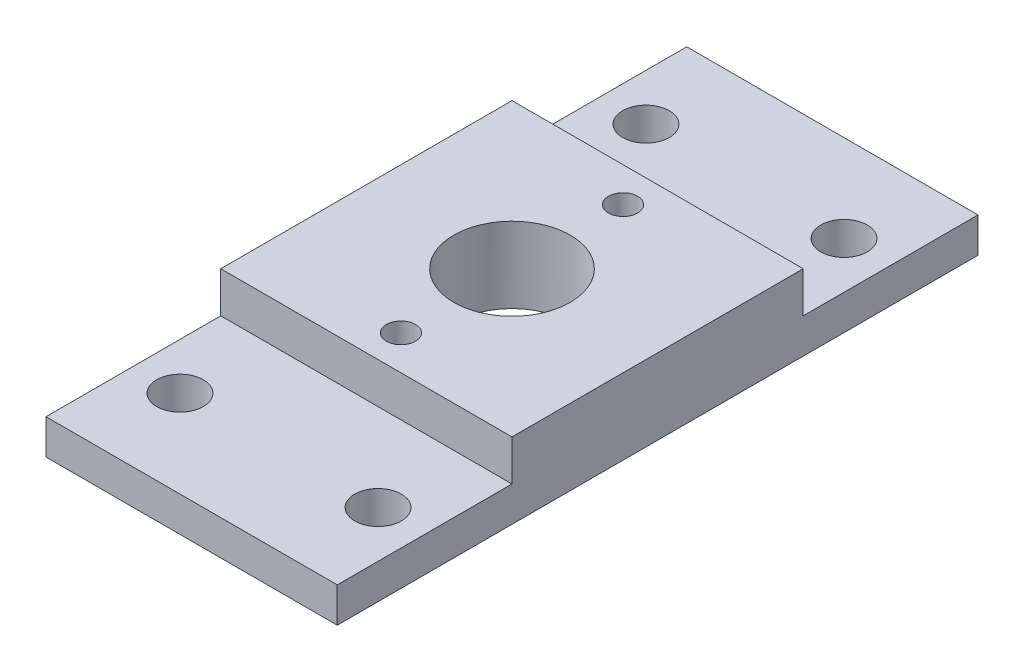
ISO-10303-21;
HEADER;
FILE_DESCRIPTION(('STEP AP214'),'2;1');
FILE_NAME('part.step','',(''),(''),'','','');
FILE_SCHEMA(('AUTOMOTIVE_DESIGN { 1 0 10303 214 1 1 1 1 }'));
ENDSEC;
DATA;
#1=APPLICATION_CONTEXT('core data for automotive mechanical design processes');
#2=APPLICATION_PROTOCOL_DEFINITION('international standard','automotive_design',2000,#1);
#3=PRODUCT_CONTEXT('',#1,'mechanical');
#4=PRODUCT('Part','Part','',(#3));
#5=PRODUCT_RELATED_PRODUCT_CATEGORY('part','',(#4));
#6=PRODUCT_DEFINITION_FORMATION('','',#4);
#7=PRODUCT_DEFINITION_CONTEXT('part definition',#1,'design');
#8=PRODUCT_DEFINITION('design','',#6,#7);
#9=PRODUCT_DEFINITION_SHAPE('','',#8);
#10=(LENGTH_UNIT() NAMED_UNIT(*) SI_UNIT(.MILLI.,.METRE.));
#11=(NAMED_UNIT(*) PLANE_ANGLE_UNIT() SI_UNIT($,.RADIAN.));
#12=(NAMED_UNIT(*) SI_UNIT($,.STERADIAN.) SOLID_ANGLE_UNIT());
#13=UNCERTAINTY_MEASURE_WITH_UNIT(LENGTH_MEASURE(1.E-05),#10,'distance_accuracy_value','');
#14=(GEOMETRIC_REPRESENTATION_CONTEXT(3) GLOBAL_UNCERTAINTY_ASSIGNED_CONTEXT((#13)) GLOBAL_UNIT_ASSIGNED_CONTEXT((#10,
#11,#12)) REPRESENTATION_CONTEXT('',''));
#15=CARTESIAN_POINT('',(0.,0.,0.));
#16=DIRECTION('',(0.,0.,1.));
#17=DIRECTION('',(1.,0.,0.));
#18=AXIS2_PLACEMENT_3D('',#15,#16,#17);
#19=CARTESIAN_POINT('',(-12.5,3.,27.5));
#20=DIRECTION('',(0.,0.,1.));
#21=DIRECTION('',(1.,0.,0.));
#22=AXIS2_PLACEMENT_3D('',#19,#20,#21);
#23=PLANE('',#22);
#24=DIRECTION('',(1.,0.,0.));
#25=VECTOR('',#24,1.);
#26=CARTESIAN_POINT('',(-12.5,0.,27.5));
#27=LINE('',#26,#25);
#28=CARTESIAN_POINT('',(-12.5,0.,27.5));
#29=VERTEX_POINT('',#28);
#30=CARTESIAN_POINT('',(12.5,0.,27.5));
#31=VERTEX_POINT('',#30);
#32=EDGE_CURVE('E13',#29,#31,#27,.T.);
#33=ORIENTED_EDGE('',*,*,#32,.T.);
#34=DIRECTION('',(0.,-1.,0.));
#35=VECTOR('',#34,1.);
#36=CARTESIAN_POINT('',(12.5,3.,27.5));
#37=LINE('',#36,#35);
#38=CARTESIAN_POINT('',(12.5,3.,27.5));
#39=VERTEX_POINT('',#38);
#40=EDGE_CURVE('E125',#39,#31,#37,.T.);
#41=ORIENTED_EDGE('',*,*,#40,.F.);
#42=DIRECTION('',(1.,0.,0.));
#43=VECTOR('',#42,1.);
#44=CARTESIAN_POINT('',(-12.5,3.,27.5));
#45=LINE('',#44,#43);
#46=CARTESIAN_POINT('',(-12.5,3.,27.5));
#47=VERTEX_POINT('',#46);
#48=EDGE_CURVE('E54',#47,#39,#45,.T.);
#49=ORIENTED_EDGE('',*,*,#48,.F.);
#50=DIRECTION('',(0.,-1.,0.));
#51=VECTOR('',#50,1.);
#52=CARTESIAN_POINT('',(-12.5,3.,27.5));
#53=LINE('',#52,#51);
#54=EDGE_CURVE('E116',#47,#29,#53,.T.);
#55=ORIENTED_EDGE('',*,*,#54,.T.);
#56=EDGE_LOOP('',(#33,#41,#49,#55));
#57=FACE_BOUND('',#56,.T.);
#58=ADVANCED_FACE('F45',(#57),#23,.T.);
#59=CARTESIAN_POINT('',(-12.5,3.,12.5));
#60=DIRECTION('',(0.,1.,0.));
#61=DIRECTION('',(0.,0.,1.));
#62=AXIS2_PLACEMENT_3D('',#59,#60,#61);
#63=PLANE('',#62);
#64=CARTESIAN_POINT('',(8.5,3.,20.));
#65=DIRECTION('',(0.,1.,0.));
#66=DIRECTION('',(0.,0.,1.));
#67=AXIS2_PLACEMENT_3D('',#64,#65,#66);
#68=CIRCLE('',#67,2.);
#69=CARTESIAN_POINT('',(8.5,3.,22.));
#70=VERTEX_POINT('',#69);
#71=EDGE_CURVE('E257',#70,#70,#68,.T.);
#72=ORIENTED_EDGE('',*,*,#71,.F.);
#73=EDGE_LOOP('',(#72));
#74=FACE_BOUND('',#73,.T.);
#75=CARTESIAN_POINT('',(-8.5,3.,20.));
#76=DIRECTION('',(0.,1.,0.));
#77=DIRECTION('',(0.,0.,-1.));
#78=AXIS2_PLACEMENT_3D('',#75,#76,#77);
#79=CIRCLE('',#78,2.);
#80=CARTESIAN_POINT('',(-8.5,3.,18.));
#81=VERTEX_POINT('',#80);
#82=EDGE_CURVE('E252',#81,#81,#79,.T.);
#83=ORIENTED_EDGE('',*,*,#82,.F.);
#84=EDGE_LOOP('',(#83));
#85=FACE_BOUND('',#84,.T.);
#86=ORIENTED_EDGE('',*,*,#48,.T.);
#87=DIRECTION('',(0.,0.,1.));
#88=VECTOR('',#87,1.);
#89=CARTESIAN_POINT('',(12.5,3.,12.5));
#90=LINE('',#89,#88);
#91=CARTESIAN_POINT('',(12.5,3.,12.5));
#92=VERTEX_POINT('',#91);
#93=EDGE_CURVE('E143',#92,#39,#90,.T.);
#94=ORIENTED_EDGE('',*,*,#93,.F.);
#95=DIRECTION('',(1.,0.,0.));
#96=VECTOR('',#95,1.);
#97=CARTESIAN_POINT('',(-12.5,3.,12.5));
#98=LINE('',#97,#96);
#99=CARTESIAN_POINT('',(-12.5,3.,12.5));
#100=VERTEX_POINT('',#99);
#101=EDGE_CURVE('E165',#100,#92,#98,.T.);
#102=ORIENTED_EDGE('',*,*,#101,.F.);
#103=DIRECTION('',(0.,0.,1.));
#104=VECTOR('',#103,1.);
#105=CARTESIAN_POINT('',(-12.5,3.,12.5));
#106=LINE('',#105,#104);
#107=EDGE_CURVE('E161',#100,#47,#106,.T.);
#108=ORIENTED_EDGE('',*,*,#107,.T.);
#109=EDGE_LOOP('',(#86,#94,#102,#108));
#110=FACE_BOUND('',#109,.T.);
#111=ADVANCED_FACE('F193',(#74,#85,#110),#63,.T.);
#112=CARTESIAN_POINT('',(-12.5,6.5,12.5));
#113=DIRECTION('',(0.,0.,1.));
#114=DIRECTION('',(1.,0.,0.));
#115=AXIS2_PLACEMENT_3D('',#112,#113,#114);
#116=PLANE('',#115);
#117=ORIENTED_EDGE('',*,*,#101,.T.);
#118=DIRECTION('',(0.,-1.,0.));
#119=VECTOR('',#118,1.);
#120=CARTESIAN_POINT('',(12.5,6.5,12.5));
#121=LINE('',#120,#119);
#122=CARTESIAN_POINT('',(12.5,6.5,12.5));
#123=VERTEX_POINT('',#122);
#124=EDGE_CURVE('E140',#123,#92,#121,.T.);
#125=ORIENTED_EDGE('',*,*,#124,.F.);
#126=DIRECTION('',(1.,0.,0.));
#127=VECTOR('',#126,1.);
#128=CARTESIAN_POINT('',(-12.5,6.5,12.5));
#129=LINE('',#128,#127);
#130=CARTESIAN_POINT('',(-12.5,6.5,12.5));
#131=VERTEX_POINT('',#130);
#132=EDGE_CURVE('E167',#131,#123,#129,.T.);
#133=ORIENTED_EDGE('',*,*,#132,.F.);
#134=DIRECTION('',(0.,-1.,0.));
#135=VECTOR('',#134,1.);
#136=CARTESIAN_POINT('',(-12.5,6.5,12.5));
#137=LINE('',#136,#135);
#138=EDGE_CURVE('E158',#131,#100,#137,.T.);
#139=ORIENTED_EDGE('',*,*,#138,.T.);
#140=EDGE_LOOP('',(#117,#125,#133,#139));
#141=FACE_BOUND('',#140,.T.);
#142=ADVANCED_FACE('F189',(#141),#116,.T.);
#143=CARTESIAN_POINT('',(-12.5,6.5,-12.5));
#144=DIRECTION('',(0.,1.,0.));
#145=DIRECTION('',(0.,0.,1.));
#146=AXIS2_PLACEMENT_3D('',#143,#144,#145);
#147=PLANE('',#146);
#148=CARTESIAN_POINT('',(0.,6.5,-9.53));
#149=DIRECTION('',(0.,1.,0.));
#150=DIRECTION('',(0.,0.,1.));
#151=AXIS2_PLACEMENT_3D('',#148,#149,#150);
#152=CIRCLE('',#151,1.24999999999999);
#153=CARTESIAN_POINT('',(0.,6.5,-8.28000000000001));
#154=VERTEX_POINT('',#153);
#155=EDGE_CURVE('E273',#154,#154,#152,.T.);
#156=ORIENTED_EDGE('',*,*,#155,.F.);
#157=EDGE_LOOP('',(#156));
#158=FACE_BOUND('',#157,.T.);
#159=CARTESIAN_POINT('',(0.,6.5,9.53));
#160=DIRECTION('',(0.,1.,0.));
#161=DIRECTION('',(0.,0.,1.));
#162=AXIS2_PLACEMENT_3D('',#159,#160,#161);
#163=CIRCLE('',#162,1.24999999999999);
#164=CARTESIAN_POINT('',(0.,6.5,10.78));
#165=VERTEX_POINT('',#164);
#166=EDGE_CURVE('E269',#165,#165,#163,.T.);
#167=ORIENTED_EDGE('',*,*,#166,.F.);
#168=EDGE_LOOP('',(#167));
#169=FACE_BOUND('',#168,.T.);
#170=CARTESIAN_POINT('',(0.,6.5,0.));
#171=DIRECTION('',(0.,1.,0.));
#172=DIRECTION('',(0.,0.,1.));
#173=AXIS2_PLACEMENT_3D('',#170,#171,#172);
#174=CIRCLE('',#173,5.);
#175=CARTESIAN_POINT('',(0.,6.5,5.));
#176=VERTEX_POINT('',#175);
#177=EDGE_CURVE('E255',#176,#176,#174,.T.);
#178=ORIENTED_EDGE('',*,*,#177,.F.);
#179=EDGE_LOOP('',(#178));
#180=FACE_BOUND('',#179,.T.);
#181=ORIENTED_EDGE('',*,*,#132,.T.);
#182=DIRECTION('',(0.,0.,1.));
#183=VECTOR('',#182,1.);
#184=CARTESIAN_POINT('',(12.5,6.5,-12.5));
#185=LINE('',#184,#183);
#186=CARTESIAN_POINT('',(12.5,6.5,-12.5));
#187=VERTEX_POINT('',#186);
#188=EDGE_CURVE('E137',#187,#123,#185,.T.);
#189=ORIENTED_EDGE('',*,*,#188,.F.);
#190=DIRECTION('',(1.,0.,0.));
#191=VECTOR('',#190,1.);
#192=CARTESIAN_POINT('',(-12.5,6.5,-12.5));
#193=LINE('',#192,#191);
#194=CARTESIAN_POINT('',(-12.5,6.5,-12.5));
#195=VERTEX_POINT('',#194);
#196=EDGE_CURVE('E169',#195,#187,#193,.T.);
#197=ORIENTED_EDGE('',*,*,#196,.F.);
#198=DIRECTION('',(0.,0.,1.));
#199=VECTOR('',#198,1.);
#200=CARTESIAN_POINT('',(-12.5,6.5,-12.5));
#201=LINE('',#200,#199);
#202=EDGE_CURVE('E155',#195,#131,#201,.T.);
#203=ORIENTED_EDGE('',*,*,#202,.T.);
#204=EDGE_LOOP('',(#181,#189,#197,#203));
#205=FACE_BOUND('',#204,.T.);
#206=ADVANCED_FACE('F182',(#158,#169,#180,#205),#147,.T.);
#207=CARTESIAN_POINT('',(-12.5,3.,-12.5));
#208=DIRECTION('',(0.,0.,-1.));
#209=DIRECTION('',(-1.,0.,0.));
#210=AXIS2_PLACEMENT_3D('',#207,#208,#209);
#211=PLANE('',#210);
#212=ORIENTED_EDGE('',*,*,#196,.T.);
#213=DIRECTION('',(0.,1.,0.));
#214=VECTOR('',#213,1.);
#215=CARTESIAN_POINT('',(12.5,3.,-12.5));
#216=LINE('',#215,#214);
#217=CARTESIAN_POINT('',(12.5,3.,-12.5));
#218=VERTEX_POINT('',#217);
#219=EDGE_CURVE('E131',#218,#187,#216,.T.);
#220=ORIENTED_EDGE('',*,*,#219,.F.);
#221=DIRECTION('',(1.,0.,0.));
#222=VECTOR('',#221,1.);
#223=CARTESIAN_POINT('',(-12.5,3.,-12.5));
#224=LINE('',#223,#222);
#225=CARTESIAN_POINT('',(-12.5,3.,-12.5));
#226=VERTEX_POINT('',#225);
#227=EDGE_CURVE('E171',#226,#218,#224,.T.);
#228=ORIENTED_EDGE('',*,*,#227,.F.);
#229=DIRECTION('',(0.,1.,0.));
#230=VECTOR('',#229,1.);
#231=CARTESIAN_POINT('',(-12.5,3.,-12.5));
#232=LINE('',#231,#230);
#233=EDGE_CURVE('E152',#226,#195,#232,.T.);
#234=ORIENTED_EDGE('',*,*,#233,.T.);
#235=EDGE_LOOP('',(#212,#220,#228,#234));
#236=FACE_BOUND('',#235,.T.);
#237=ADVANCED_FACE('F179',(#236),#211,.T.);
#238=CARTESIAN_POINT('',(-12.5,3.,-27.5));
#239=DIRECTION('',(0.,1.,0.));
#240=DIRECTION('',(0.,0.,1.));
#241=AXIS2_PLACEMENT_3D('',#238,#239,#240);
#242=PLANE('',#241);
#243=CARTESIAN_POINT('',(8.5,3.,-20.));
#244=DIRECTION('',(0.,1.,0.));
#245=DIRECTION('',(0.,0.,-1.));
#246=AXIS2_PLACEMENT_3D('',#243,#244,#245);
#247=CIRCLE('',#246,2.);
#248=CARTESIAN_POINT('',(8.5,3.,-22.));
#249=VERTEX_POINT('',#248);
#250=EDGE_CURVE('E261',#249,#249,#247,.T.);
#251=ORIENTED_EDGE('',*,*,#250,.F.);
#252=EDGE_LOOP('',(#251));
#253=FACE_BOUND('',#252,.T.);
#254=CARTESIAN_POINT('',(-8.5,3.,-20.));
#255=DIRECTION('',(0.,1.,0.));
#256=DIRECTION('',(0.,0.,1.));
#257=AXIS2_PLACEMENT_3D('',#254,#255,#256);
#258=CIRCLE('',#257,2.);
#259=CARTESIAN_POINT('',(-8.5,3.,-18.));
#260=VERTEX_POINT('',#259);
#261=EDGE_CURVE('E248',#260,#260,#258,.T.);
#262=ORIENTED_EDGE('',*,*,#261,.F.);
#263=EDGE_LOOP('',(#262));
#264=FACE_BOUND('',#263,.T.);
#265=ORIENTED_EDGE('',*,*,#227,.T.);
#266=DIRECTION('',(0.,0.,1.));
#267=VECTOR('',#266,1.);
#268=CARTESIAN_POINT('',(12.5,3.,-27.5));
#269=LINE('',#268,#267);
#270=CARTESIAN_POINT('',(12.5,3.,-27.5));
#271=VERTEX_POINT('',#270);
#272=EDGE_CURVE('E129',#271,#218,#269,.T.);
#273=ORIENTED_EDGE('',*,*,#272,.F.);
#274=DIRECTION('',(1.,0.,0.));
#275=VECTOR('',#274,1.);
#276=CARTESIAN_POINT('',(-12.5,3.,-27.5));
#277=LINE('',#276,#275);
#278=CARTESIAN_POINT('',(-12.5,3.,-27.5));
#279=VERTEX_POINT('',#278);
#280=EDGE_CURVE('E115',#279,#271,#277,.T.);
#281=ORIENTED_EDGE('',*,*,#280,.F.);
#282=DIRECTION('',(0.,0.,1.));
#283=VECTOR('',#282,1.);
#284=CARTESIAN_POINT('',(-12.5,3.,-27.5));
#285=LINE('',#284,#283);
#286=EDGE_CURVE('E149',#279,#226,#285,.T.);
#287=ORIENTED_EDGE('',*,*,#286,.T.);
#288=EDGE_LOOP('',(#265,#273,#281,#287));
#289=FACE_BOUND('',#288,.T.);
#290=ADVANCED_FACE('F173',(#253,#264,#289),#242,.T.);
#291=CARTESIAN_POINT('',(-12.5,0.,-27.5));
#292=DIRECTION('',(0.,0.,-1.));
#293=DIRECTION('',(-1.,0.,0.));
#294=AXIS2_PLACEMENT_3D('',#291,#292,#293);
#295=PLANE('',#294);
#296=ORIENTED_EDGE('',*,*,#280,.T.);
#297=DIRECTION('',(0.,1.,0.));
#298=VECTOR('',#297,1.);
#299=CARTESIAN_POINT('',(12.5,0.,-27.5));
#300=LINE('',#299,#298);
#301=CARTESIAN_POINT('',(12.5,0.,-27.5));
#302=VERTEX_POINT('',#301);
#303=EDGE_CURVE('E122',#302,#271,#300,.T.);
#304=ORIENTED_EDGE('',*,*,#303,.F.);
#305=DIRECTION('',(1.,0.,0.));
#306=VECTOR('',#305,1.);
#307=CARTESIAN_POINT('',(-12.5,0.,-27.5));
#308=LINE('',#307,#306);
#309=CARTESIAN_POINT('',(-12.5,0.,-27.5));
#310=VERTEX_POINT('',#309);
#311=EDGE_CURVE('E49',#310,#302,#308,.T.);
#312=ORIENTED_EDGE('',*,*,#311,.F.);
#313=DIRECTION('',(0.,1.,0.));
#314=VECTOR('',#313,1.);
#315=CARTESIAN_POINT('',(-12.5,0.,-27.5));
#316=LINE('',#315,#314);
#317=EDGE_CURVE('E147',#310,#279,#316,.T.);
#318=ORIENTED_EDGE('',*,*,#317,.T.);
#319=EDGE_LOOP('',(#296,#304,#312,#318));
#320=FACE_BOUND('',#319,.T.);
#321=ADVANCED_FACE('F128',(#320),#295,.T.);
#322=CARTESIAN_POINT('',(-12.5,0.,0.));
#323=DIRECTION('',(0.,-1.,0.));
#324=DIRECTION('',(0.,0.,-1.));
#325=AXIS2_PLACEMENT_3D('',#322,#323,#324);
#326=PLANE('',#325);
#327=CARTESIAN_POINT('',(0.,0.,-9.53));
#328=DIRECTION('',(0.,-1.,0.));
#329=DIRECTION('',(0.,0.,-1.));
#330=AXIS2_PLACEMENT_3D('',#327,#328,#329);
#331=CIRCLE('',#330,1.24999999999999);
#332=CARTESIAN_POINT('',(0.,0.,-10.78));
#333=VERTEX_POINT('',#332);
#334=EDGE_CURVE('E224',#333,#333,#331,.T.);
#335=ORIENTED_EDGE('',*,*,#334,.F.);
#336=EDGE_LOOP('',(#335));
#337=FACE_BOUND('',#336,.T.);
#338=CARTESIAN_POINT('',(0.,0.,9.53));
#339=DIRECTION('',(0.,-1.,0.));
#340=DIRECTION('',(0.,0.,-1.));
#341=AXIS2_PLACEMENT_3D('',#338,#339,#340);
#342=CIRCLE('',#341,1.24999999999999);
#343=CARTESIAN_POINT('',(0.,0.,8.28000000000001));
#344=VERTEX_POINT('',#343);
#345=EDGE_CURVE('E228',#344,#344,#342,.T.);
#346=ORIENTED_EDGE('',*,*,#345,.F.);
#347=EDGE_LOOP('',(#346));
#348=FACE_BOUND('',#347,.T.);
#349=CARTESIAN_POINT('',(0.,0.,0.));
#350=DIRECTION('',(0.,-1.,0.));
#351=DIRECTION('',(0.,0.,-1.));
#352=AXIS2_PLACEMENT_3D('',#349,#350,#351);
#353=CIRCLE('',#352,5.);
#354=CARTESIAN_POINT('',(0.,0.,-5.));
#355=VERTEX_POINT('',#354);
#356=EDGE_CURVE('E232',#355,#355,#353,.F.);
#357=ORIENTED_EDGE('',*,*,#356,.T.);
#358=EDGE_LOOP('',(#357));
#359=FACE_BOUND('',#358,.T.);
#360=CARTESIAN_POINT('',(8.5,0.,-20.));
#361=DIRECTION('',(0.,1.,0.));
#362=DIRECTION('',(0.,0.,-1.));
#363=AXIS2_PLACEMENT_3D('',#360,#361,#362);
#364=CIRCLE('',#363,2.);
#365=CARTESIAN_POINT('',(8.5,0.,-22.));
#366=VERTEX_POINT('',#365);
#367=EDGE_CURVE('E236',#366,#366,#364,.T.);
#368=ORIENTED_EDGE('',*,*,#367,.T.);
#369=EDGE_LOOP('',(#368));
#370=FACE_BOUND('',#369,.T.);
#371=CARTESIAN_POINT('',(8.5,0.,20.));
#372=DIRECTION('',(0.,1.,0.));
#373=DIRECTION('',(0.,0.,1.));
#374=AXIS2_PLACEMENT_3D('',#371,#372,#373);
#375=CIRCLE('',#374,2.);
#376=CARTESIAN_POINT('',(8.5,0.,22.));
#377=VERTEX_POINT('',#376);
#378=EDGE_CURVE('E240',#377,#377,#375,.T.);
#379=ORIENTED_EDGE('',*,*,#378,.T.);
#380=EDGE_LOOP('',(#379));
#381=FACE_BOUND('',#380,.T.);
#382=CARTESIAN_POINT('',(-8.5,0.,20.));
#383=DIRECTION('',(0.,1.,0.));
#384=DIRECTION('',(0.,0.,-1.));
#385=AXIS2_PLACEMENT_3D('',#382,#383,#384);
#386=CIRCLE('',#385,2.);
#387=CARTESIAN_POINT('',(-8.5,0.,18.));
#388=VERTEX_POINT('',#387);
#389=EDGE_CURVE('E244',#388,#388,#386,.T.);
#390=ORIENTED_EDGE('',*,*,#389,.T.);
#391=EDGE_LOOP('',(#390));
#392=FACE_BOUND('',#391,.T.);
#393=CARTESIAN_POINT('',(-8.5,0.,-20.));
#394=DIRECTION('',(0.,1.,0.));
#395=DIRECTION('',(0.,0.,1.));
#396=AXIS2_PLACEMENT_3D('',#393,#394,#395);
#397=CIRCLE('',#396,2.);
#398=CARTESIAN_POINT('',(-8.5,0.,-18.));
#399=VERTEX_POINT('',#398);
#400=EDGE_CURVE('E126',#399,#399,#397,.T.);
#401=ORIENTED_EDGE('',*,*,#400,.T.);
#402=EDGE_LOOP('',(#401));
#403=FACE_BOUND('',#402,.T.);
#404=ORIENTED_EDGE('',*,*,#311,.T.);
#405=DIRECTION('',(0.,0.,-1.));
#406=VECTOR('',#405,1.);
#407=CARTESIAN_POINT('',(12.5,0.,27.5));
#408=LINE('',#407,#406);
#409=EDGE_CURVE('E109',#31,#302,#408,.T.);
#410=ORIENTED_EDGE('',*,*,#409,.F.);
#411=ORIENTED_EDGE('',*,*,#32,.F.);
#412=DIRECTION('',(0.,0.,-1.));
#413=VECTOR('',#412,1.);
#414=CARTESIAN_POINT('',(-12.5,0.,27.5));
#415=LINE('',#414,#413);
#416=EDGE_CURVE('E110',#29,#310,#415,.T.);
#417=ORIENTED_EDGE('',*,*,#416,.T.);
#418=EDGE_LOOP('',(#404,#410,#411,#417));
#419=FACE_BOUND('',#418,.T.);
#420=ADVANCED_FACE('F47',(#337,#348,#359,#370,#381,#392,#403,#419),#326,.T.);
#421=CARTESIAN_POINT('',(-12.5,0.,0.));
#422=DIRECTION('',(1.,0.,0.));
#423=DIRECTION('',(0.,0.,-1.));
#424=AXIS2_PLACEMENT_3D('',#421,#422,#423);
#425=PLANE('',#424);
#426=ORIENTED_EDGE('',*,*,#416,.F.);
#427=ORIENTED_EDGE('',*,*,#54,.F.);
#428=ORIENTED_EDGE('',*,*,#107,.F.);
#429=ORIENTED_EDGE('',*,*,#138,.F.);
#430=ORIENTED_EDGE('',*,*,#202,.F.);
#431=ORIENTED_EDGE('',*,*,#233,.F.);
#432=ORIENTED_EDGE('',*,*,#286,.F.);
#433=ORIENTED_EDGE('',*,*,#317,.F.);
#434=EDGE_LOOP('',(#426,#427,#428,#429,#430,#431,#432,#433));
#435=FACE_BOUND('',#434,.T.);
#436=ADVANCED_FACE('F185',(#435),#425,.F.);
#437=CARTESIAN_POINT('',(12.5,0.,0.));
#438=DIRECTION('',(1.,0.,0.));
#439=DIRECTION('',(0.,0.,-1.));
#440=AXIS2_PLACEMENT_3D('',#437,#438,#439);
#441=PLANE('',#440);
#442=ORIENTED_EDGE('',*,*,#409,.T.);
#443=ORIENTED_EDGE('',*,*,#303,.T.);
#444=ORIENTED_EDGE('',*,*,#272,.T.);
#445=ORIENTED_EDGE('',*,*,#219,.T.);
#446=ORIENTED_EDGE('',*,*,#188,.T.);
#447=ORIENTED_EDGE('',*,*,#124,.T.);
#448=ORIENTED_EDGE('',*,*,#93,.T.);
#449=ORIENTED_EDGE('',*,*,#40,.T.);
#450=EDGE_LOOP('',(#442,#443,#444,#445,#446,#447,#448,#449));
#451=FACE_BOUND('',#450,.T.);
#452=ADVANCED_FACE('F120',(#451),#441,.T.);
#453=CARTESIAN_POINT('',(-8.5,0.,-20.));
#454=DIRECTION('',(0.,1.,0.));
#455=DIRECTION('',(0.,0.,1.));
#456=AXIS2_PLACEMENT_3D('',#453,#454,#455);
#457=CYLINDRICAL_SURFACE('',#456,2.);
#458=ORIENTED_EDGE('',*,*,#400,.F.);
#459=EDGE_LOOP('',(#458));
#460=FACE_BOUND('',#459,.T.);
#461=ORIENTED_EDGE('',*,*,#261,.T.);
#462=EDGE_LOOP('',(#461));
#463=FACE_BOUND('',#462,.T.);
#464=ADVANCED_FACE('F307',(#460,#463),#457,.F.);
#465=CARTESIAN_POINT('',(-8.5,0.,20.));
#466=DIRECTION('',(0.,1.,0.));
#467=DIRECTION('',(0.,0.,1.));
#468=AXIS2_PLACEMENT_3D('',#465,#466,#467);
#469=CYLINDRICAL_SURFACE('',#468,2.);
#470=ORIENTED_EDGE('',*,*,#389,.F.);
#471=EDGE_LOOP('',(#470));
#472=FACE_BOUND('',#471,.T.);
#473=ORIENTED_EDGE('',*,*,#82,.T.);
#474=EDGE_LOOP('',(#473));
#475=FACE_BOUND('',#474,.T.);
#476=ADVANCED_FACE('F303',(#472,#475),#469,.F.);
#477=CARTESIAN_POINT('',(8.5,0.,20.));
#478=DIRECTION('',(0.,1.,0.));
#479=DIRECTION('',(0.,0.,1.));
#480=AXIS2_PLACEMENT_3D('',#477,#478,#479);
#481=CYLINDRICAL_SURFACE('',#480,2.);
#482=ORIENTED_EDGE('',*,*,#378,.F.);
#483=EDGE_LOOP('',(#482));
#484=FACE_BOUND('',#483,.T.);
#485=ORIENTED_EDGE('',*,*,#71,.T.);
#486=EDGE_LOOP('',(#485));
#487=FACE_BOUND('',#486,.T.);
#488=ADVANCED_FACE('F296',(#484,#487),#481,.F.);
#489=CARTESIAN_POINT('',(8.5,0.,-20.));
#490=DIRECTION('',(0.,1.,0.));
#491=DIRECTION('',(0.,0.,1.));
#492=AXIS2_PLACEMENT_3D('',#489,#490,#491);
#493=CYLINDRICAL_SURFACE('',#492,2.);
#494=ORIENTED_EDGE('',*,*,#367,.F.);
#495=EDGE_LOOP('',(#494));
#496=FACE_BOUND('',#495,.T.);
#497=ORIENTED_EDGE('',*,*,#250,.T.);
#498=EDGE_LOOP('',(#497));
#499=FACE_BOUND('',#498,.T.);
#500=ADVANCED_FACE('F287',(#496,#499),#493,.F.);
#501=CARTESIAN_POINT('',(0.,-0.00100000000000013,0.));
#502=DIRECTION('',(0.,1.,0.));
#503=DIRECTION('',(0.,0.,1.));
#504=AXIS2_PLACEMENT_3D('',#501,#502,#503);
#505=CYLINDRICAL_SURFACE('',#504,5.);
#506=ORIENTED_EDGE('',*,*,#356,.F.);
#507=EDGE_LOOP('',(#506));
#508=FACE_BOUND('',#507,.T.);
#509=ORIENTED_EDGE('',*,*,#177,.T.);
#510=EDGE_LOOP('',(#509));
#511=FACE_BOUND('',#510,.T.);
#512=ADVANCED_FACE('F284',(#508,#511),#505,.F.);
#513=CARTESIAN_POINT('',(0.,6.5,9.53));
#514=DIRECTION('',(0.,1.,0.));
#515=DIRECTION('',(0.,0.,1.));
#516=AXIS2_PLACEMENT_3D('',#513,#514,#515);
#517=CYLINDRICAL_SURFACE('',#516,1.24999999999999);
#518=ORIENTED_EDGE('',*,*,#166,.T.);
#519=EDGE_LOOP('',(#518));
#520=FACE_BOUND('',#519,.T.);
#521=ORIENTED_EDGE('',*,*,#345,.T.);
#522=EDGE_LOOP('',(#521));
#523=FACE_BOUND('',#522,.T.);
#524=ADVANCED_FACE('F286',(#520,#523),#517,.F.);
#525=CARTESIAN_POINT('',(0.,6.5,-9.53));
#526=DIRECTION('',(0.,1.,0.));
#527=DIRECTION('',(0.,0.,1.));
#528=AXIS2_PLACEMENT_3D('',#525,#526,#527);
#529=CYLINDRICAL_SURFACE('',#528,1.24999999999999);
#530=ORIENTED_EDGE('',*,*,#155,.T.);
#531=EDGE_LOOP('',(#530));
#532=FACE_BOUND('',#531,.T.);
#533=ORIENTED_EDGE('',*,*,#334,.T.);
#534=EDGE_LOOP('',(#533));
#535=FACE_BOUND('',#534,.T.);
#536=ADVANCED_FACE('F277',(#532,#535),#529,.F.);
#537=CLOSED_SHELL('',(#58,#111,#142,#206,#237,#290,#321,#420,#436,#452,#464,#476,#488,#500,#512,
#524,#536));
#538=MANIFOLD_SOLID_BREP('B2',#537);
#539=ADVANCED_BREP_SHAPE_REPRESENTATION('',(#18,#538),#14);
#540=SHAPE_DEFINITION_REPRESENTATION(#9,#539);
ENDSEC;
END-ISO-10303-21;
